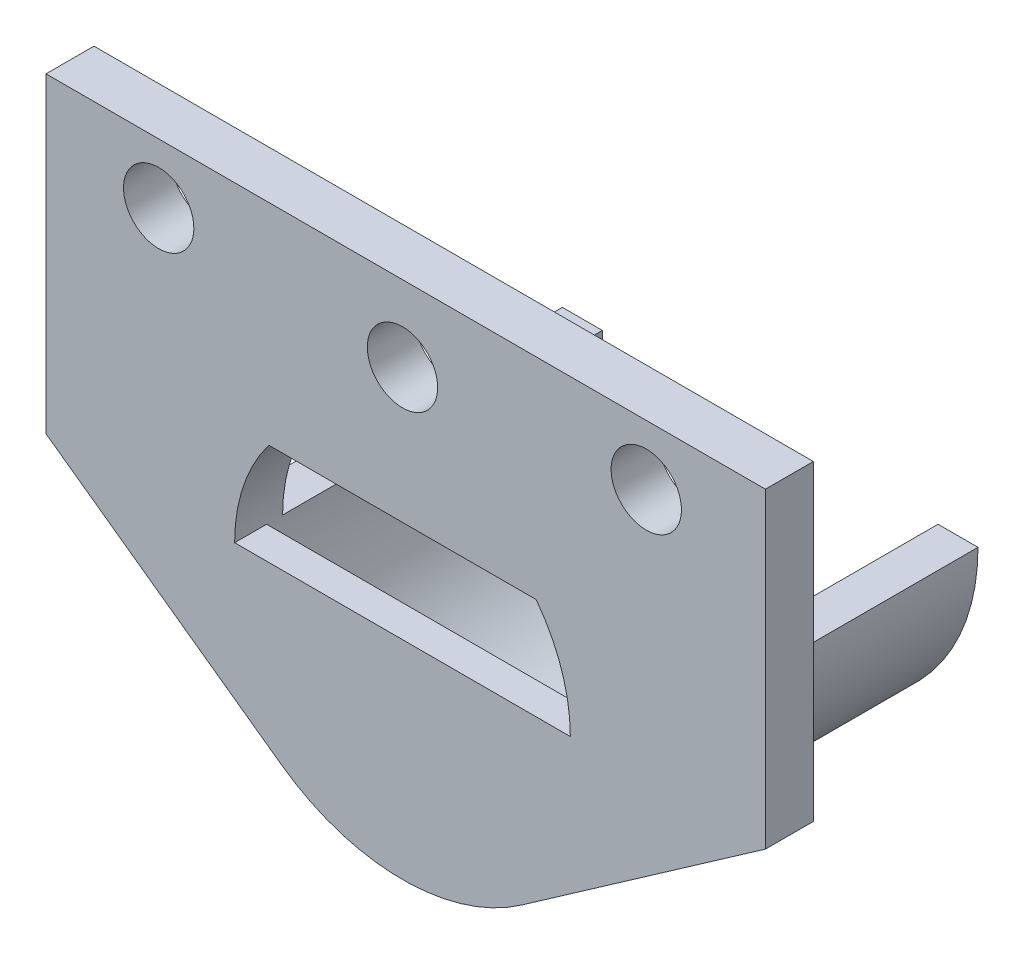
ISO-10303-21;
HEADER;
FILE_DESCRIPTION(('STEP AP214'),'2;1');
FILE_NAME('part.step','',(''),(''),'','','');
FILE_SCHEMA(('AUTOMOTIVE_DESIGN { 1 0 10303 214 1 1 1 1 }'));
ENDSEC;
DATA;
#1=APPLICATION_CONTEXT('core data for automotive mechanical design processes');
#2=APPLICATION_PROTOCOL_DEFINITION('international standard','automotive_design',2000,#1);
#3=PRODUCT_CONTEXT('',#1,'mechanical');
#4=PRODUCT('Part','Part','',(#3));
#5=PRODUCT_RELATED_PRODUCT_CATEGORY('part','',(#4));
#6=PRODUCT_DEFINITION_FORMATION('','',#4);
#7=PRODUCT_DEFINITION_CONTEXT('part definition',#1,'design');
#8=PRODUCT_DEFINITION('design','',#6,#7);
#9=PRODUCT_DEFINITION_SHAPE('','',#8);
#10=(LENGTH_UNIT() NAMED_UNIT(*) SI_UNIT(.MILLI.,.METRE.));
#11=(NAMED_UNIT(*) PLANE_ANGLE_UNIT() SI_UNIT($,.RADIAN.));
#12=(NAMED_UNIT(*) SI_UNIT($,.STERADIAN.) SOLID_ANGLE_UNIT());
#13=UNCERTAINTY_MEASURE_WITH_UNIT(LENGTH_MEASURE(1.E-05),#10,'distance_accuracy_value','');
#14=(GEOMETRIC_REPRESENTATION_CONTEXT(3) GLOBAL_UNCERTAINTY_ASSIGNED_CONTEXT((#13)) GLOBAL_UNIT_ASSIGNED_CONTEXT((#10,
#11,#12)) REPRESENTATION_CONTEXT('',''));
#15=CARTESIAN_POINT('',(0.,0.,0.));
#16=DIRECTION('',(0.,0.,1.));
#17=DIRECTION('',(1.,0.,0.));
#18=AXIS2_PLACEMENT_3D('',#15,#16,#17);
#19=CARTESIAN_POINT('',(8236.96943647304,2993.6134101707,0.));
#20=DIRECTION('',(0.,0.,1.));
#21=DIRECTION('',(1.,0.,0.));
#22=AXIS2_PLACEMENT_3D('',#19,#20,#21);
#23=PLANE('',#22);
#24=CARTESIAN_POINT('',(8252.21943647304,3009.36627584749,0.));
#25=DIRECTION('',(0.,0.,1.));
#26=DIRECTION('',(1.,0.,0.));
#27=AXIS2_PLACEMENT_3D('',#24,#25,#26);
#28=CIRCLE('',#27,2.19999999999973);
#29=CARTESIAN_POINT('',(8254.41943647304,3009.36627584749,0.));
#30=VERTEX_POINT('',#29);
#31=EDGE_CURVE('E199',#30,#30,#28,.T.);
#32=ORIENTED_EDGE('',*,*,#31,.T.);
#33=EDGE_LOOP('',(#32));
#34=FACE_BOUND('',#33,.T.);
#35=CARTESIAN_POINT('',(8221.71943647304,3009.36627584749,0.));
#36=DIRECTION('',(0.,0.,1.));
#37=DIRECTION('',(1.,0.,0.));
#38=AXIS2_PLACEMENT_3D('',#35,#36,#37);
#39=CIRCLE('',#38,2.19999999999973);
#40=CARTESIAN_POINT('',(8223.91943647304,3009.36627584749,0.));
#41=VERTEX_POINT('',#40);
#42=EDGE_CURVE('E220',#41,#41,#39,.T.);
#43=ORIENTED_EDGE('',*,*,#42,.T.);
#44=EDGE_LOOP('',(#43));
#45=FACE_BOUND('',#44,.T.);
#46=CARTESIAN_POINT('',(8236.96943647304,3008.36627584749,0.));
#47=DIRECTION('',(0.,0.,1.));
#48=DIRECTION('',(1.,0.,0.));
#49=AXIS2_PLACEMENT_3D('',#46,#47,#48);
#50=CIRCLE('',#49,2.19999999999973);
#51=CARTESIAN_POINT('',(8239.16943647304,3008.36627584749,0.));
#52=VERTEX_POINT('',#51);
#53=EDGE_CURVE('E228',#52,#52,#50,.T.);
#54=ORIENTED_EDGE('',*,*,#53,.T.);
#55=EDGE_LOOP('',(#54));
#56=FACE_BOUND('',#55,.T.);
#57=DIRECTION('',(1.,0.,0.));
#58=VECTOR('',#57,1.);
#59=CARTESIAN_POINT('',(8226.46943647304,2993.6134101707,0.));
#60=LINE('',#59,#58);
#61=CARTESIAN_POINT('',(8223.97000737279,2993.6134101707,0.));
#62=VERTEX_POINT('',#61);
#63=CARTESIAN_POINT('',(8226.46943647304,2993.6134101707,0.));
#64=VERTEX_POINT('',#63);
#65=EDGE_CURVE('E63',#62,#64,#60,.T.);
#66=ORIENTED_EDGE('',*,*,#65,.F.);
#67=CARTESIAN_POINT('',(8236.96943647304,2993.6134101707,0.));
#68=DIRECTION('',(0.,0.,-1.));
#69=DIRECTION('',(-1.,0.,0.));
#70=AXIS2_PLACEMENT_3D('',#67,#68,#69);
#71=CIRCLE('',#70,12.9994291002493);
#72=CARTESIAN_POINT('',(8229.39116402407,2983.05145279427,0.));
#73=VERTEX_POINT('',#72);
#74=EDGE_CURVE('E11',#73,#62,#71,.T.);
#75=ORIENTED_EDGE('',*,*,#74,.F.);
#76=DIRECTION('',(0.812493940694173,-0.58296963586044,0.));
#77=VECTOR('',#76,1.);
#78=CARTESIAN_POINT('',(8214.67079808673,2993.6134101707,0.));
#79=LINE('',#78,#77);
#80=CARTESIAN_POINT('',(8214.67079808673,2993.6134101707,0.));
#81=VERTEX_POINT('',#80);
#82=EDGE_CURVE('E270',#81,#73,#79,.T.);
#83=ORIENTED_EDGE('',*,*,#82,.F.);
#84=DIRECTION('',(0.,-1.,0.));
#85=VECTOR('',#84,1.);
#86=CARTESIAN_POINT('',(8214.67079808673,3013.1134101707,0.));
#87=LINE('',#86,#85);
#88=CARTESIAN_POINT('',(8214.67079808673,3013.1134101707,0.));
#89=VERTEX_POINT('',#88);
#90=EDGE_CURVE('E242',#89,#81,#87,.T.);
#91=ORIENTED_EDGE('',*,*,#90,.F.);
#92=DIRECTION('',(-1.,0.,0.));
#93=VECTOR('',#92,1.);
#94=CARTESIAN_POINT('',(8214.67079808673,3013.1134101707,0.));
#95=LINE('',#94,#93);
#96=CARTESIAN_POINT('',(8259.67079808673,3013.1134101707,0.));
#97=VERTEX_POINT('',#96);
#98=EDGE_CURVE('E251',#97,#89,#95,.T.);
#99=ORIENTED_EDGE('',*,*,#98,.F.);
#100=DIRECTION('',(0.,1.,0.));
#101=VECTOR('',#100,1.);
#102=CARTESIAN_POINT('',(8259.67079808673,3013.1134101707,0.));
#103=LINE('',#102,#101);
#104=CARTESIAN_POINT('',(8259.67079808673,2993.6134101707,0.));
#105=VERTEX_POINT('',#104);
#106=EDGE_CURVE('E277',#105,#97,#103,.T.);
#107=ORIENTED_EDGE('',*,*,#106,.F.);
#108=DIRECTION('',(0.81981551966968,0.57262772698214,0.));
#109=VECTOR('',#108,1.);
#110=CARTESIAN_POINT('',(8259.67079808673,2993.6134101707,0.));
#111=LINE('',#110,#109);
#112=CARTESIAN_POINT('',(8244.41327001078,2982.95627644747,0.));
#113=VERTEX_POINT('',#112);
#114=EDGE_CURVE('E274',#113,#105,#111,.T.);
#115=ORIENTED_EDGE('',*,*,#114,.F.);
#116=CARTESIAN_POINT('',(8249.96886557329,2993.6134101707,0.));
#117=VERTEX_POINT('',#116);
#118=EDGE_CURVE('E56',#117,#113,#71,.T.);
#119=ORIENTED_EDGE('',*,*,#118,.F.);
#120=DIRECTION('',(1.,0.,0.));
#121=VECTOR('',#120,1.);
#122=CARTESIAN_POINT('',(8247.46943647304,2993.6134101707,0.));
#123=LINE('',#122,#121);
#124=CARTESIAN_POINT('',(8247.46943647304,2993.6134101707,0.));
#125=VERTEX_POINT('',#124);
#126=EDGE_CURVE('E326',#125,#117,#123,.T.);
#127=ORIENTED_EDGE('',*,*,#126,.F.);
#128=CARTESIAN_POINT('',(8236.96943647304,2993.6134101707,0.));
#129=DIRECTION('',(0.,0.,1.));
#130=DIRECTION('',(1.,0.,0.));
#131=AXIS2_PLACEMENT_3D('',#128,#129,#130);
#132=CIRCLE('',#131,10.5000000000006);
#133=EDGE_CURVE('E67',#125,#64,#132,.T.);
#134=ORIENTED_EDGE('',*,*,#133,.T.);
#135=EDGE_LOOP('',(#66,#75,#83,#91,#99,#107,#115,#119,#127,#134));
#136=FACE_BOUND('',#135,.T.);
#137=ADVANCED_FACE('F45',(#34,#45,#56,#136),#23,.F.);
#138=CARTESIAN_POINT('',(8236.96943647304,2993.6134101707,3.));
#139=DIRECTION('',(0.,0.,1.));
#140=DIRECTION('',(1.,0.,0.));
#141=AXIS2_PLACEMENT_3D('',#138,#139,#140);
#142=PLANE('',#141);
#143=CARTESIAN_POINT('',(8221.71943647304,3009.36627584749,3.));
#144=DIRECTION('',(0.,0.,1.));
#145=DIRECTION('',(1.,0.,0.));
#146=AXIS2_PLACEMENT_3D('',#143,#144,#145);
#147=CIRCLE('',#146,2.19999999999973);
#148=CARTESIAN_POINT('',(8223.91943647304,3009.36627584749,3.));
#149=VERTEX_POINT('',#148);
#150=EDGE_CURVE('E224',#149,#149,#147,.T.);
#151=ORIENTED_EDGE('',*,*,#150,.F.);
#152=EDGE_LOOP('',(#151));
#153=FACE_BOUND('',#152,.T.);
#154=CARTESIAN_POINT('',(8236.96943647304,2993.6134101707,3.));
#155=DIRECTION('',(0.,0.,1.));
#156=DIRECTION('',(1.,0.,0.));
#157=AXIS2_PLACEMENT_3D('',#154,#155,#156);
#158=CIRCLE('',#157,10.5000000000006);
#159=CARTESIAN_POINT('',(8247.46943647304,2993.6134101707,3.));
#160=VERTEX_POINT('',#159);
#161=CARTESIAN_POINT('',(8245.33100298067,2999.96433179977,3.));
#162=VERTEX_POINT('',#161);
#163=EDGE_CURVE('E239',#160,#162,#158,.T.);
#164=ORIENTED_EDGE('',*,*,#163,.F.);
#165=DIRECTION('',(-1.,0.,0.));
#166=VECTOR('',#165,1.);
#167=CARTESIAN_POINT('',(8247.46943647304,2993.6134101707,3.));
#168=LINE('',#167,#166);
#169=CARTESIAN_POINT('',(8226.46943647304,2993.6134101707,3.));
#170=VERTEX_POINT('',#169);
#171=EDGE_CURVE('E186',#160,#170,#168,.T.);
#172=ORIENTED_EDGE('',*,*,#171,.T.);
#173=CARTESIAN_POINT('',(8228.60786996541,2999.96433179977,3.));
#174=VERTEX_POINT('',#173);
#175=EDGE_CURVE('E243',#174,#170,#158,.T.);
#176=ORIENTED_EDGE('',*,*,#175,.F.);
#177=DIRECTION('',(1.,0.,0.));
#178=VECTOR('',#177,1.);
#179=CARTESIAN_POINT('',(8228.60786996541,2999.96433179977,3.));
#180=LINE('',#179,#178);
#181=EDGE_CURVE('E194',#174,#162,#180,.T.);
#182=ORIENTED_EDGE('',*,*,#181,.T.);
#183=EDGE_LOOP('',(#164,#172,#176,#182));
#184=FACE_BOUND('',#183,.T.);
#185=DIRECTION('',(0.,-1.,0.));
#186=VECTOR('',#185,1.);
#187=CARTESIAN_POINT('',(8214.67079808673,3013.1134101707,3.));
#188=LINE('',#187,#186);
#189=CARTESIAN_POINT('',(8214.67079808673,3013.1134101707,3.));
#190=VERTEX_POINT('',#189);
#191=CARTESIAN_POINT('',(8214.67079808673,2993.6134101707,3.));
#192=VERTEX_POINT('',#191);
#193=EDGE_CURVE('E246',#190,#192,#188,.T.);
#194=ORIENTED_EDGE('',*,*,#193,.T.);
#195=DIRECTION('',(0.812493940694173,-0.58296963586044,0.));
#196=VECTOR('',#195,1.);
#197=CARTESIAN_POINT('',(8214.67079808673,2993.6134101707,3.));
#198=LINE('',#197,#196);
#199=CARTESIAN_POINT('',(8229.39116402407,2983.05145279427,3.));
#200=VERTEX_POINT('',#199);
#201=EDGE_CURVE('E250',#192,#200,#198,.T.);
#202=ORIENTED_EDGE('',*,*,#201,.T.);
#203=CARTESIAN_POINT('',(8236.96943647304,2993.6134101707,3.));
#204=DIRECTION('',(0.,0.,1.));
#205=DIRECTION('',(1.,0.,0.));
#206=AXIS2_PLACEMENT_3D('',#203,#204,#205);
#207=CIRCLE('',#206,12.9994291002488);
#208=CARTESIAN_POINT('',(8244.41327001078,2982.95627644747,3.));
#209=VERTEX_POINT('',#208);
#210=EDGE_CURVE('E254',#200,#209,#207,.T.);
#211=ORIENTED_EDGE('',*,*,#210,.T.);
#212=DIRECTION('',(0.81981551966968,0.57262772698214,0.));
#213=VECTOR('',#212,1.);
#214=CARTESIAN_POINT('',(8259.67079808673,2993.6134101707,3.));
#215=LINE('',#214,#213);
#216=CARTESIAN_POINT('',(8259.67079808673,2993.6134101707,3.));
#217=VERTEX_POINT('',#216);
#218=EDGE_CURVE('E257',#209,#217,#215,.T.);
#219=ORIENTED_EDGE('',*,*,#218,.T.);
#220=DIRECTION('',(0.,1.,0.));
#221=VECTOR('',#220,1.);
#222=CARTESIAN_POINT('',(8259.67079808673,3013.1134101707,3.));
#223=LINE('',#222,#221);
#224=CARTESIAN_POINT('',(8259.67079808673,3013.1134101707,3.));
#225=VERTEX_POINT('',#224);
#226=EDGE_CURVE('E260',#217,#225,#223,.T.);
#227=ORIENTED_EDGE('',*,*,#226,.T.);
#228=DIRECTION('',(-1.,0.,0.));
#229=VECTOR('',#228,1.);
#230=CARTESIAN_POINT('',(8214.67079808673,3013.1134101707,3.));
#231=LINE('',#230,#229);
#232=EDGE_CURVE('E263',#225,#190,#231,.T.);
#233=ORIENTED_EDGE('',*,*,#232,.T.);
#234=EDGE_LOOP('',(#194,#202,#211,#219,#227,#233));
#235=FACE_BOUND('',#234,.T.);
#236=CARTESIAN_POINT('',(8236.96943647304,3008.36627584749,3.));
#237=DIRECTION('',(0.,0.,1.));
#238=DIRECTION('',(1.,0.,0.));
#239=AXIS2_PLACEMENT_3D('',#236,#237,#238);
#240=CIRCLE('',#239,2.19999999999973);
#241=CARTESIAN_POINT('',(8239.16943647304,3008.36627584749,3.));
#242=VERTEX_POINT('',#241);
#243=EDGE_CURVE('E232',#242,#242,#240,.T.);
#244=ORIENTED_EDGE('',*,*,#243,.F.);
#245=EDGE_LOOP('',(#244));
#246=FACE_BOUND('',#245,.T.);
#247=CARTESIAN_POINT('',(8252.21943647304,3009.36627584749,3.));
#248=DIRECTION('',(0.,0.,1.));
#249=DIRECTION('',(1.,0.,0.));
#250=AXIS2_PLACEMENT_3D('',#247,#248,#249);
#251=CIRCLE('',#250,2.19999999999973);
#252=CARTESIAN_POINT('',(8254.41943647304,3009.36627584749,3.));
#253=VERTEX_POINT('',#252);
#254=EDGE_CURVE('E216',#253,#253,#251,.T.);
#255=ORIENTED_EDGE('',*,*,#254,.F.);
#256=EDGE_LOOP('',(#255));
#257=FACE_BOUND('',#256,.T.);
#258=ADVANCED_FACE('F344',(#153,#184,#235,#246,#257),#142,.T.);
#259=CARTESIAN_POINT('',(8214.67079808673,3013.1134101707,3.));
#260=DIRECTION('',(1.,0.,0.));
#261=DIRECTION('',(0.,0.,-1.));
#262=AXIS2_PLACEMENT_3D('',#259,#260,#261);
#263=PLANE('',#262);
#264=ORIENTED_EDGE('',*,*,#90,.T.);
#265=DIRECTION('',(0.,0.,-1.));
#266=VECTOR('',#265,1.);
#267=CARTESIAN_POINT('',(8214.67079808673,2993.6134101707,3.));
#268=LINE('',#267,#266);
#269=EDGE_CURVE('E49',#192,#81,#268,.T.);
#270=ORIENTED_EDGE('',*,*,#269,.F.);
#271=ORIENTED_EDGE('',*,*,#193,.F.);
#272=DIRECTION('',(0.,0.,-1.));
#273=VECTOR('',#272,1.);
#274=CARTESIAN_POINT('',(8214.67079808673,3013.1134101707,3.));
#275=LINE('',#274,#273);
#276=EDGE_CURVE('E266',#190,#89,#275,.T.);
#277=ORIENTED_EDGE('',*,*,#276,.T.);
#278=EDGE_LOOP('',(#264,#270,#271,#277));
#279=FACE_BOUND('',#278,.T.);
#280=ADVANCED_FACE('F47',(#279),#263,.F.);
#281=CARTESIAN_POINT('',(8214.67079808673,2993.6134101707,3.));
#282=DIRECTION('',(0.58296963586044,0.812493940694173,0.));
#283=DIRECTION('',(-0.812493940694173,0.58296963586044,0.));
#284=AXIS2_PLACEMENT_3D('',#281,#282,#283);
#285=PLANE('',#284);
#286=ORIENTED_EDGE('',*,*,#82,.T.);
#287=DIRECTION('',(0.,0.,-1.));
#288=VECTOR('',#287,1.);
#289=CARTESIAN_POINT('',(8229.39116402407,2983.05145279427,3.));
#290=LINE('',#289,#288);
#291=EDGE_CURVE('E295',#200,#73,#290,.T.);
#292=ORIENTED_EDGE('',*,*,#291,.F.);
#293=ORIENTED_EDGE('',*,*,#201,.F.);
#294=ORIENTED_EDGE('',*,*,#269,.T.);
#295=EDGE_LOOP('',(#286,#292,#293,#294));
#296=FACE_BOUND('',#295,.T.);
#297=ADVANCED_FACE('F305',(#296),#285,.F.);
#298=CARTESIAN_POINT('',(8236.96943647304,2993.6134101707,3.));
#299=DIRECTION('',(0.,0.,-1.));
#300=DIRECTION('',(-1.,0.,0.));
#301=AXIS2_PLACEMENT_3D('',#298,#299,#300);
#302=CYLINDRICAL_SURFACE('',#301,12.9994291002488);
#303=ORIENTED_EDGE('',*,*,#291,.T.);
#304=ORIENTED_EDGE('',*,*,#74,.T.);
#305=DIRECTION('',(0.,0.,1.));
#306=VECTOR('',#305,1.);
#307=CARTESIAN_POINT('',(8223.97000737279,2993.6134101707,-20.));
#308=LINE('',#307,#306);
#309=CARTESIAN_POINT('',(8223.97000737279,2993.6134101707,-20.));
#310=VERTEX_POINT('',#309);
#311=EDGE_CURVE('E178',#310,#62,#308,.T.);
#312=ORIENTED_EDGE('',*,*,#311,.F.);
#313=CARTESIAN_POINT('',(8236.96943647304,2993.6134101707,-20.));
#314=DIRECTION('',(0.,0.,-1.));
#315=DIRECTION('',(-1.,0.,0.));
#316=AXIS2_PLACEMENT_3D('',#313,#314,#315);
#317=CIRCLE('',#316,12.9994291002493);
#318=CARTESIAN_POINT('',(8249.96886557329,2993.6134101707,-20.));
#319=VERTEX_POINT('',#318);
#320=EDGE_CURVE('E157',#319,#310,#317,.T.);
#321=ORIENTED_EDGE('',*,*,#320,.F.);
#322=DIRECTION('',(0.,0.,1.));
#323=VECTOR('',#322,1.);
#324=CARTESIAN_POINT('',(8249.96886557329,2993.6134101707,-20.));
#325=LINE('',#324,#323);
#326=EDGE_CURVE('E153',#319,#117,#325,.T.);
#327=ORIENTED_EDGE('',*,*,#326,.T.);
#328=ORIENTED_EDGE('',*,*,#118,.T.);
#329=DIRECTION('',(0.,0.,-1.));
#330=VECTOR('',#329,1.);
#331=CARTESIAN_POINT('',(8244.41327001078,2982.95627644747,3.));
#332=LINE('',#331,#330);
#333=EDGE_CURVE('E293',#209,#113,#332,.T.);
#334=ORIENTED_EDGE('',*,*,#333,.F.);
#335=ORIENTED_EDGE('',*,*,#210,.F.);
#336=EDGE_LOOP('',(#303,#304,#312,#321,#327,#328,#334,#335));
#337=FACE_BOUND('',#336,.T.);
#338=ADVANCED_FACE('F314',(#337),#302,.T.);
#339=CARTESIAN_POINT('',(8259.67079808673,2993.6134101707,3.));
#340=DIRECTION('',(-0.57262772698214,0.81981551966968,0.));
#341=DIRECTION('',(-0.81981551966968,-0.57262772698214,0.));
#342=AXIS2_PLACEMENT_3D('',#339,#340,#341);
#343=PLANE('',#342);
#344=ORIENTED_EDGE('',*,*,#114,.T.);
#345=DIRECTION('',(0.,0.,-1.));
#346=VECTOR('',#345,1.);
#347=CARTESIAN_POINT('',(8259.67079808673,2993.6134101707,3.));
#348=LINE('',#347,#346);
#349=EDGE_CURVE('E289',#217,#105,#348,.T.);
#350=ORIENTED_EDGE('',*,*,#349,.F.);
#351=ORIENTED_EDGE('',*,*,#218,.F.);
#352=ORIENTED_EDGE('',*,*,#333,.T.);
#353=EDGE_LOOP('',(#344,#350,#351,#352));
#354=FACE_BOUND('',#353,.T.);
#355=ADVANCED_FACE('F337',(#354),#343,.F.);
#356=CARTESIAN_POINT('',(8259.67079808673,3013.1134101707,3.));
#357=DIRECTION('',(-1.,0.,0.));
#358=DIRECTION('',(0.,0.,1.));
#359=AXIS2_PLACEMENT_3D('',#356,#357,#358);
#360=PLANE('',#359);
#361=ORIENTED_EDGE('',*,*,#106,.T.);
#362=DIRECTION('',(0.,0.,-1.));
#363=VECTOR('',#362,1.);
#364=CARTESIAN_POINT('',(8259.67079808673,3013.1134101707,3.));
#365=LINE('',#364,#363);
#366=EDGE_CURVE('E285',#225,#97,#365,.T.);
#367=ORIENTED_EDGE('',*,*,#366,.F.);
#368=ORIENTED_EDGE('',*,*,#226,.F.);
#369=ORIENTED_EDGE('',*,*,#349,.T.);
#370=EDGE_LOOP('',(#361,#367,#368,#369));
#371=FACE_BOUND('',#370,.T.);
#372=ADVANCED_FACE('F340',(#371),#360,.F.);
#373=CARTESIAN_POINT('',(8214.67079808673,3013.1134101707,3.));
#374=DIRECTION('',(0.,-1.,0.));
#375=DIRECTION('',(0.,0.,-1.));
#376=AXIS2_PLACEMENT_3D('',#373,#374,#375);
#377=PLANE('',#376);
#378=ORIENTED_EDGE('',*,*,#98,.T.);
#379=ORIENTED_EDGE('',*,*,#276,.F.);
#380=ORIENTED_EDGE('',*,*,#232,.F.);
#381=ORIENTED_EDGE('',*,*,#366,.T.);
#382=EDGE_LOOP('',(#378,#379,#380,#381));
#383=FACE_BOUND('',#382,.T.);
#384=ADVANCED_FACE('F347',(#383),#377,.F.);
#385=CARTESIAN_POINT('',(8236.96943647304,2993.6134101707,3.));
#386=DIRECTION('',(0.,0.,-1.));
#387=DIRECTION('',(-1.,0.,0.));
#388=AXIS2_PLACEMENT_3D('',#385,#386,#387);
#389=CYLINDRICAL_SURFACE('',#388,10.5000000000006);
#390=DIRECTION('',(0.,0.,1.));
#391=VECTOR('',#390,1.);
#392=CARTESIAN_POINT('',(8247.46943647304,2993.6134101707,1.));
#393=LINE('',#392,#391);
#394=CARTESIAN_POINT('',(8247.46943647304,2993.6134101707,1.));
#395=VERTEX_POINT('',#394);
#396=EDGE_CURVE('E190',#395,#160,#393,.T.);
#397=ORIENTED_EDGE('',*,*,#396,.T.);
#398=ORIENTED_EDGE('',*,*,#163,.T.);
#399=DIRECTION('',(0.,0.,1.));
#400=VECTOR('',#399,1.);
#401=CARTESIAN_POINT('',(8245.33100298067,2999.96433179977,1.));
#402=LINE('',#401,#400);
#403=CARTESIAN_POINT('',(8245.33100298067,2999.96433179977,1.));
#404=VERTEX_POINT('',#403);
#405=EDGE_CURVE('E171',#404,#162,#402,.T.);
#406=ORIENTED_EDGE('',*,*,#405,.F.);
#407=CARTESIAN_POINT('',(8236.96943647304,2993.6134101707,1.));
#408=DIRECTION('',(0.,0.,1.));
#409=DIRECTION('',(1.,0.,0.));
#410=AXIS2_PLACEMENT_3D('',#407,#408,#409);
#411=CIRCLE('',#410,10.5000000000004);
#412=CARTESIAN_POINT('',(8228.60786996541,2999.96433179977,1.));
#413=VERTEX_POINT('',#412);
#414=EDGE_CURVE('E210',#404,#413,#411,.T.);
#415=ORIENTED_EDGE('',*,*,#414,.T.);
#416=DIRECTION('',(0.,0.,1.));
#417=VECTOR('',#416,1.);
#418=CARTESIAN_POINT('',(8228.60786996541,2999.96433179977,1.));
#419=LINE('',#418,#417);
#420=EDGE_CURVE('E176',#413,#174,#419,.T.);
#421=ORIENTED_EDGE('',*,*,#420,.T.);
#422=ORIENTED_EDGE('',*,*,#175,.T.);
#423=DIRECTION('',(0.,0.,1.));
#424=VECTOR('',#423,1.);
#425=CARTESIAN_POINT('',(8226.46943647304,2993.6134101707,1.));
#426=LINE('',#425,#424);
#427=CARTESIAN_POINT('',(8226.46943647304,2993.6134101707,1.));
#428=VERTEX_POINT('',#427);
#429=EDGE_CURVE('E195',#428,#170,#426,.T.);
#430=ORIENTED_EDGE('',*,*,#429,.F.);
#431=CARTESIAN_POINT('',(8236.96943647304,2993.6134101707,1.));
#432=DIRECTION('',(0.,0.,1.));
#433=DIRECTION('',(1.,0.,0.));
#434=AXIS2_PLACEMENT_3D('',#431,#432,#433);
#435=CIRCLE('',#434,10.5000000000004);
#436=EDGE_CURVE('E182',#428,#395,#435,.T.);
#437=ORIENTED_EDGE('',*,*,#436,.T.);
#438=EDGE_LOOP('',(#397,#398,#406,#415,#421,#422,#430,#437));
#439=FACE_BOUND('',#438,.T.);
#440=ORIENTED_EDGE('',*,*,#133,.F.);
#441=DIRECTION('',(0.,0.,1.));
#442=VECTOR('',#441,1.);
#443=CARTESIAN_POINT('',(8247.46943647304,2993.6134101707,-20.));
#444=LINE('',#443,#442);
#445=CARTESIAN_POINT('',(8247.46943647304,2993.6134101707,-20.));
#446=VERTEX_POINT('',#445);
#447=EDGE_CURVE('E151',#446,#125,#444,.T.);
#448=ORIENTED_EDGE('',*,*,#447,.F.);
#449=CARTESIAN_POINT('',(8236.96943647304,2993.6134101707,-20.));
#450=DIRECTION('',(0.,0.,1.));
#451=DIRECTION('',(-1.,0.,0.));
#452=AXIS2_PLACEMENT_3D('',#449,#450,#451);
#453=CIRCLE('',#452,10.5000000000004);
#454=CARTESIAN_POINT('',(8226.46943647304,2993.6134101707,-20.));
#455=VERTEX_POINT('',#454);
#456=EDGE_CURVE('E158',#455,#446,#453,.T.);
#457=ORIENTED_EDGE('',*,*,#456,.F.);
#458=DIRECTION('',(0.,0.,1.));
#459=VECTOR('',#458,1.);
#460=CARTESIAN_POINT('',(8226.46943647304,2993.6134101707,-20.));
#461=LINE('',#460,#459);
#462=EDGE_CURVE('E318',#455,#64,#461,.T.);
#463=ORIENTED_EDGE('',*,*,#462,.T.);
#464=EDGE_LOOP('',(#440,#448,#457,#463));
#465=FACE_BOUND('',#464,.T.);
#466=ADVANCED_FACE('F169',(#439,#465),#389,.F.);
#467=CARTESIAN_POINT('',(8236.96943647304,3008.36627584749,3.));
#468=DIRECTION('',(0.,0.,-1.));
#469=DIRECTION('',(-1.,0.,0.));
#470=AXIS2_PLACEMENT_3D('',#467,#468,#469);
#471=CYLINDRICAL_SURFACE('',#470,2.19999999999973);
#472=ORIENTED_EDGE('',*,*,#243,.T.);
#473=EDGE_LOOP('',(#472));
#474=FACE_BOUND('',#473,.T.);
#475=ORIENTED_EDGE('',*,*,#53,.F.);
#476=EDGE_LOOP('',(#475));
#477=FACE_BOUND('',#476,.T.);
#478=ADVANCED_FACE('F355',(#474,#477),#471,.F.);
#479=CARTESIAN_POINT('',(8221.71943647304,3009.36627584749,3.));
#480=DIRECTION('',(0.,0.,-1.));
#481=DIRECTION('',(-1.,0.,0.));
#482=AXIS2_PLACEMENT_3D('',#479,#480,#481);
#483=CYLINDRICAL_SURFACE('',#482,2.19999999999973);
#484=ORIENTED_EDGE('',*,*,#150,.T.);
#485=EDGE_LOOP('',(#484));
#486=FACE_BOUND('',#485,.T.);
#487=ORIENTED_EDGE('',*,*,#42,.F.);
#488=EDGE_LOOP('',(#487));
#489=FACE_BOUND('',#488,.T.);
#490=ADVANCED_FACE('F372',(#486,#489),#483,.F.);
#491=CARTESIAN_POINT('',(8252.21943647304,3009.36627584749,3.));
#492=DIRECTION('',(0.,0.,-1.));
#493=DIRECTION('',(-1.,0.,0.));
#494=AXIS2_PLACEMENT_3D('',#491,#492,#493);
#495=CYLINDRICAL_SURFACE('',#494,2.19999999999973);
#496=ORIENTED_EDGE('',*,*,#254,.T.);
#497=EDGE_LOOP('',(#496));
#498=FACE_BOUND('',#497,.T.);
#499=ORIENTED_EDGE('',*,*,#31,.F.);
#500=EDGE_LOOP('',(#499));
#501=FACE_BOUND('',#500,.T.);
#502=ADVANCED_FACE('F376',(#498,#501),#495,.F.);
#503=CARTESIAN_POINT('',(8228.60786996541,2999.96433179977,1.));
#504=DIRECTION('',(0.,-1.,0.));
#505=DIRECTION('',(1.,0.,0.));
#506=AXIS2_PLACEMENT_3D('',#503,#504,#505);
#507=PLANE('',#506);
#508=ORIENTED_EDGE('',*,*,#181,.F.);
#509=ORIENTED_EDGE('',*,*,#420,.F.);
#510=DIRECTION('',(1.,0.,0.));
#511=VECTOR('',#510,1.);
#512=CARTESIAN_POINT('',(8228.60786996541,2999.96433179977,1.));
#513=LINE('',#512,#511);
#514=EDGE_CURVE('E205',#413,#404,#513,.T.);
#515=ORIENTED_EDGE('',*,*,#514,.T.);
#516=ORIENTED_EDGE('',*,*,#405,.T.);
#517=EDGE_LOOP('',(#508,#509,#515,#516));
#518=FACE_BOUND('',#517,.T.);
#519=ADVANCED_FACE('F380',(#518),#507,.T.);
#520=CARTESIAN_POINT('',(8236.96943647304,2993.6134101707,1.));
#521=DIRECTION('',(0.,0.,1.));
#522=DIRECTION('',(1.,0.,0.));
#523=AXIS2_PLACEMENT_3D('',#520,#521,#522);
#524=PLANE('',#523);
#525=ORIENTED_EDGE('',*,*,#414,.F.);
#526=ORIENTED_EDGE('',*,*,#514,.F.);
#527=EDGE_LOOP('',(#525,#526));
#528=FACE_BOUND('',#527,.T.);
#529=ADVANCED_FACE('F382',(#528),#524,.F.);
#530=CARTESIAN_POINT('',(8247.46943647304,2993.6134101707,1.));
#531=DIRECTION('',(0.,1.,0.));
#532=DIRECTION('',(0.,0.,1.));
#533=AXIS2_PLACEMENT_3D('',#530,#531,#532);
#534=PLANE('',#533);
#535=ORIENTED_EDGE('',*,*,#171,.F.);
#536=ORIENTED_EDGE('',*,*,#396,.F.);
#537=DIRECTION('',(-1.,0.,0.));
#538=VECTOR('',#537,1.);
#539=CARTESIAN_POINT('',(8247.46943647304,2993.6134101707,1.));
#540=LINE('',#539,#538);
#541=EDGE_CURVE('E185',#395,#428,#540,.T.);
#542=ORIENTED_EDGE('',*,*,#541,.T.);
#543=ORIENTED_EDGE('',*,*,#429,.T.);
#544=EDGE_LOOP('',(#535,#536,#542,#543));
#545=FACE_BOUND('',#544,.T.);
#546=ADVANCED_FACE('F385',(#545),#534,.T.);
#547=CARTESIAN_POINT('',(8236.96943647304,2993.6134101707,1.));
#548=DIRECTION('',(0.,0.,1.));
#549=DIRECTION('',(1.,0.,0.));
#550=AXIS2_PLACEMENT_3D('',#547,#548,#549);
#551=PLANE('',#550);
#552=ORIENTED_EDGE('',*,*,#436,.F.);
#553=ORIENTED_EDGE('',*,*,#541,.F.);
#554=EDGE_LOOP('',(#552,#553));
#555=FACE_BOUND('',#554,.T.);
#556=ADVANCED_FACE('F392',(#555),#551,.F.);
#557=CARTESIAN_POINT('',(8247.46943647304,2993.6134101707,-20.));
#558=DIRECTION('',(0.,-1.,0.));
#559=DIRECTION('',(0.,0.,-1.));
#560=AXIS2_PLACEMENT_3D('',#557,#558,#559);
#561=PLANE('',#560);
#562=ORIENTED_EDGE('',*,*,#126,.T.);
#563=ORIENTED_EDGE('',*,*,#326,.F.);
#564=DIRECTION('',(1.,0.,0.));
#565=VECTOR('',#564,1.);
#566=CARTESIAN_POINT('',(8247.46943647304,2993.6134101707,-20.));
#567=LINE('',#566,#565);
#568=EDGE_CURVE('E146',#446,#319,#567,.T.);
#569=ORIENTED_EDGE('',*,*,#568,.F.);
#570=ORIENTED_EDGE('',*,*,#447,.T.);
#571=EDGE_LOOP('',(#562,#563,#569,#570));
#572=FACE_BOUND('',#571,.T.);
#573=ADVANCED_FACE('F149',(#572),#561,.F.);
#574=CARTESIAN_POINT('',(8226.46943647304,2993.6134101707,-20.));
#575=DIRECTION('',(0.,-1.,0.));
#576=DIRECTION('',(0.,0.,-1.));
#577=AXIS2_PLACEMENT_3D('',#574,#575,#576);
#578=PLANE('',#577);
#579=ORIENTED_EDGE('',*,*,#65,.T.);
#580=ORIENTED_EDGE('',*,*,#462,.F.);
#581=DIRECTION('',(1.,0.,0.));
#582=VECTOR('',#581,1.);
#583=CARTESIAN_POINT('',(8226.46943647304,2993.6134101707,-20.));
#584=LINE('',#583,#582);
#585=EDGE_CURVE('E163',#310,#455,#584,.T.);
#586=ORIENTED_EDGE('',*,*,#585,.F.);
#587=ORIENTED_EDGE('',*,*,#311,.T.);
#588=EDGE_LOOP('',(#579,#580,#586,#587));
#589=FACE_BOUND('',#588,.T.);
#590=ADVANCED_FACE('F316',(#589),#578,.F.);
#591=CARTESIAN_POINT('',(8236.96943647304,2993.6134101707,-20.));
#592=DIRECTION('',(0.,0.,-1.));
#593=DIRECTION('',(-1.,0.,0.));
#594=AXIS2_PLACEMENT_3D('',#591,#592,#593);
#595=PLANE('',#594);
#596=ORIENTED_EDGE('',*,*,#456,.T.);
#597=ORIENTED_EDGE('',*,*,#568,.T.);
#598=ORIENTED_EDGE('',*,*,#320,.T.);
#599=ORIENTED_EDGE('',*,*,#585,.T.);
#600=EDGE_LOOP('',(#596,#597,#598,#599));
#601=FACE_BOUND('',#600,.T.);
#602=ADVANCED_FACE('F161',(#601),#595,.T.);
#603=CLOSED_SHELL('',(#137,#258,#280,#297,#338,#355,#372,#384,#466,#478,#490,#502,#519,#529,
#546,#556,#573,#590,#602));
#604=MANIFOLD_SOLID_BREP('B2',#603);
#605=ADVANCED_BREP_SHAPE_REPRESENTATION('',(#18,#604),#14);
#606=SHAPE_DEFINITION_REPRESENTATION(#9,#605);
ENDSEC;
END-ISO-10303-21;
